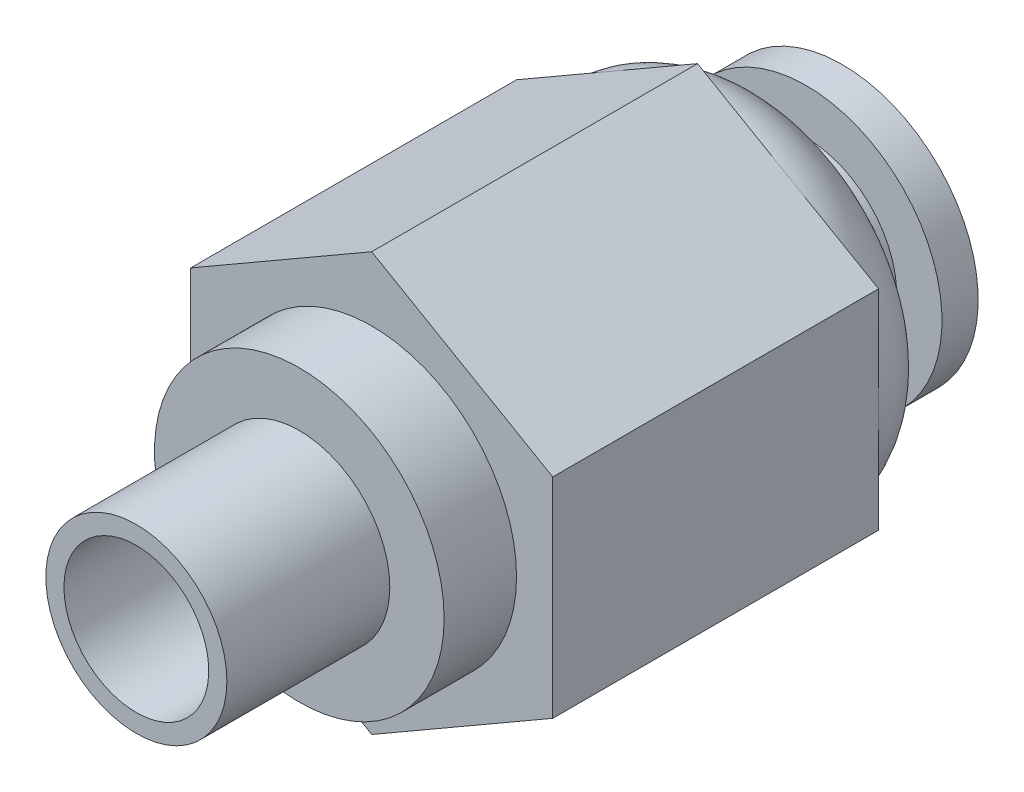
ISO-10303-21;
HEADER;
FILE_DESCRIPTION(('STEP AP214'),'2;1');
FILE_NAME('part.step','',(''),(''),'','','');
FILE_SCHEMA(('AUTOMOTIVE_DESIGN { 1 0 10303 214 1 1 1 1 }'));
ENDSEC;
DATA;
#1=APPLICATION_CONTEXT('core data for automotive mechanical design processes');
#2=APPLICATION_PROTOCOL_DEFINITION('international standard','automotive_design',2000,#1);
#3=PRODUCT_CONTEXT('',#1,'mechanical');
#4=PRODUCT('Part','Part','',(#3));
#5=PRODUCT_RELATED_PRODUCT_CATEGORY('part','',(#4));
#6=PRODUCT_DEFINITION_FORMATION('','',#4);
#7=PRODUCT_DEFINITION_CONTEXT('part definition',#1,'design');
#8=PRODUCT_DEFINITION('design','',#6,#7);
#9=PRODUCT_DEFINITION_SHAPE('','',#8);
#10=(LENGTH_UNIT() NAMED_UNIT(*) SI_UNIT(.MILLI.,.METRE.));
#11=(NAMED_UNIT(*) PLANE_ANGLE_UNIT() SI_UNIT($,.RADIAN.));
#12=(NAMED_UNIT(*) SI_UNIT($,.STERADIAN.) SOLID_ANGLE_UNIT());
#13=UNCERTAINTY_MEASURE_WITH_UNIT(LENGTH_MEASURE(1.E-05),#10,'distance_accuracy_value','');
#14=(GEOMETRIC_REPRESENTATION_CONTEXT(3) GLOBAL_UNCERTAINTY_ASSIGNED_CONTEXT((#13)) GLOBAL_UNIT_ASSIGNED_CONTEXT((#10,
#11,#12)) REPRESENTATION_CONTEXT('',''));
#15=CARTESIAN_POINT('',(0.,0.,0.));
#16=DIRECTION('',(0.,0.,1.));
#17=DIRECTION('',(1.,0.,0.));
#18=AXIS2_PLACEMENT_3D('',#15,#16,#17);
#19=CARTESIAN_POINT('',(0.,0.,0.));
#20=DIRECTION('',(0.,0.,1.));
#21=DIRECTION('',(1.,0.,0.));
#22=AXIS2_PLACEMENT_3D('',#19,#20,#21);
#23=PLANE('',#22);
#24=DIRECTION('',(0.,1.,0.));
#25=VECTOR('',#24,1.);
#26=CARTESIAN_POINT('',(5.,-2.88675134594813,0.));
#27=LINE('',#26,#25);
#28=CARTESIAN_POINT('',(5.,0.,0.));
#29=VERTEX_POINT('',#28);
#30=CARTESIAN_POINT('',(5.,2.88675134594813,0.));
#31=VERTEX_POINT('',#30);
#32=EDGE_CURVE('E154',#29,#31,#27,.T.);
#33=ORIENTED_EDGE('',*,*,#32,.F.);
#34=CARTESIAN_POINT('',(0.,0.,0.));
#35=DIRECTION('',(0.,0.,1.));
#36=DIRECTION('',(1.,0.,0.));
#37=AXIS2_PLACEMENT_3D('',#34,#35,#36);
#38=CIRCLE('',#37,5.);
#39=CARTESIAN_POINT('',(2.5,4.33012701892219,0.));
#40=VERTEX_POINT('',#39);
#41=EDGE_CURVE('E60',#29,#40,#38,.T.);
#42=ORIENTED_EDGE('',*,*,#41,.T.);
#43=DIRECTION('',(-0.866025403784439,0.5,0.));
#44=VECTOR('',#43,1.);
#45=CARTESIAN_POINT('',(5.,2.88675134594813,0.));
#46=LINE('',#45,#44);
#47=EDGE_CURVE('E155',#31,#40,#46,.T.);
#48=ORIENTED_EDGE('',*,*,#47,.F.);
#49=EDGE_LOOP('',(#33,#42,#48));
#50=FACE_BOUND('',#49,.T.);
#51=ADVANCED_FACE('F43',(#50),#23,.F.);
#52=CARTESIAN_POINT('',(0.,5.77350269189626,0.));
#53=VERTEX_POINT('',#52);
#54=EDGE_CURVE('E153',#40,#53,#46,.T.);
#55=ORIENTED_EDGE('',*,*,#54,.F.);
#56=CARTESIAN_POINT('',(0.,0.,0.));
#57=DIRECTION('',(0.,0.,1.));
#58=DIRECTION('',(1.,0.,0.));
#59=AXIS2_PLACEMENT_3D('',#56,#57,#58);
#60=CIRCLE('',#59,5.);
#61=CARTESIAN_POINT('',(-2.5,4.3301270189222,0.));
#62=VERTEX_POINT('',#61);
#63=EDGE_CURVE('E11',#40,#62,#60,.T.);
#64=ORIENTED_EDGE('',*,*,#63,.T.);
#65=DIRECTION('',(-0.866025403784439,-0.5,0.));
#66=VECTOR('',#65,1.);
#67=CARTESIAN_POINT('',(0.,5.77350269189626,0.));
#68=LINE('',#67,#66);
#69=EDGE_CURVE('E160',#53,#62,#68,.T.);
#70=ORIENTED_EDGE('',*,*,#69,.F.);
#71=EDGE_LOOP('',(#55,#64,#70));
#72=FACE_BOUND('',#71,.T.);
#73=ADVANCED_FACE('F273',(#72),#23,.F.);
#74=CARTESIAN_POINT('',(-5.,2.88675134594813,0.));
#75=VERTEX_POINT('',#74);
#76=EDGE_CURVE('E159',#62,#75,#68,.T.);
#77=ORIENTED_EDGE('',*,*,#76,.F.);
#78=CARTESIAN_POINT('',(-5.,0.,0.));
#79=VERTEX_POINT('',#78);
#80=EDGE_CURVE('E53',#62,#79,#60,.T.);
#81=ORIENTED_EDGE('',*,*,#80,.T.);
#82=DIRECTION('',(0.,-1.,0.));
#83=VECTOR('',#82,1.);
#84=CARTESIAN_POINT('',(-5.,2.88675134594813,0.));
#85=LINE('',#84,#83);
#86=EDGE_CURVE('E164',#75,#79,#85,.T.);
#87=ORIENTED_EDGE('',*,*,#86,.F.);
#88=EDGE_LOOP('',(#77,#81,#87));
#89=FACE_BOUND('',#88,.T.);
#90=ADVANCED_FACE('F280',(#89),#23,.F.);
#91=CARTESIAN_POINT('',(-5.,-2.88675134594813,0.));
#92=VERTEX_POINT('',#91);
#93=EDGE_CURVE('E132',#79,#92,#85,.T.);
#94=ORIENTED_EDGE('',*,*,#93,.F.);
#95=CARTESIAN_POINT('',(-2.5,-4.33012701892219,0.));
#96=VERTEX_POINT('',#95);
#97=EDGE_CURVE('E317',#79,#96,#60,.T.);
#98=ORIENTED_EDGE('',*,*,#97,.T.);
#99=DIRECTION('',(0.866025403784439,-0.5,0.));
#100=VECTOR('',#99,1.);
#101=CARTESIAN_POINT('',(-5.,-2.88675134594813,0.));
#102=LINE('',#101,#100);
#103=EDGE_CURVE('E168',#92,#96,#102,.T.);
#104=ORIENTED_EDGE('',*,*,#103,.F.);
#105=EDGE_LOOP('',(#94,#98,#104));
#106=FACE_BOUND('',#105,.T.);
#107=ADVANCED_FACE('F299',(#106),#23,.F.);
#108=CARTESIAN_POINT('',(0.,-5.77350269189626,0.));
#109=VERTEX_POINT('',#108);
#110=EDGE_CURVE('E167',#96,#109,#102,.T.);
#111=ORIENTED_EDGE('',*,*,#110,.F.);
#112=CARTESIAN_POINT('',(2.5,-4.33012701892219,0.));
#113=VERTEX_POINT('',#112);
#114=EDGE_CURVE('E313',#96,#113,#60,.T.);
#115=ORIENTED_EDGE('',*,*,#114,.T.);
#116=DIRECTION('',(0.866025403784438,0.5,0.));
#117=VECTOR('',#116,1.);
#118=CARTESIAN_POINT('',(0.,-5.77350269189626,0.));
#119=LINE('',#118,#117);
#120=EDGE_CURVE('E171',#109,#113,#119,.T.);
#121=ORIENTED_EDGE('',*,*,#120,.F.);
#122=EDGE_LOOP('',(#111,#115,#121));
#123=FACE_BOUND('',#122,.T.);
#124=ADVANCED_FACE('F288',(#123),#23,.F.);
#125=CARTESIAN_POINT('',(5.,-2.88675134594813,9.));
#126=DIRECTION('',(-1.,0.,0.));
#127=DIRECTION('',(0.,-1.,0.));
#128=AXIS2_PLACEMENT_3D('',#125,#126,#127);
#129=PLANE('',#128);
#130=CARTESIAN_POINT('',(5.,-2.88675134594813,0.));
#131=VERTEX_POINT('',#130);
#132=EDGE_CURVE('E149',#131,#29,#27,.T.);
#133=ORIENTED_EDGE('',*,*,#132,.T.);
#134=ORIENTED_EDGE('',*,*,#32,.T.);
#135=DIRECTION('',(0.,0.,-1.));
#136=VECTOR('',#135,1.);
#137=CARTESIAN_POINT('',(5.,2.88675134594813,9.));
#138=LINE('',#137,#136);
#139=CARTESIAN_POINT('',(5.,2.88675134594813,9.));
#140=VERTEX_POINT('',#139);
#141=EDGE_CURVE('E184',#140,#31,#138,.T.);
#142=ORIENTED_EDGE('',*,*,#141,.F.);
#143=DIRECTION('',(0.,1.,0.));
#144=VECTOR('',#143,1.);
#145=CARTESIAN_POINT('',(5.,-2.88675134594813,9.));
#146=LINE('',#145,#144);
#147=CARTESIAN_POINT('',(5.,-2.88675134594813,9.));
#148=VERTEX_POINT('',#147);
#149=EDGE_CURVE('E174',#148,#140,#146,.T.);
#150=ORIENTED_EDGE('',*,*,#149,.F.);
#151=DIRECTION('',(0.,0.,-1.));
#152=VECTOR('',#151,1.);
#153=CARTESIAN_POINT('',(5.,-2.88675134594813,9.));
#154=LINE('',#153,#152);
#155=EDGE_CURVE('E145',#148,#131,#154,.T.);
#156=ORIENTED_EDGE('',*,*,#155,.T.);
#157=EDGE_LOOP('',(#133,#134,#142,#150,#156));
#158=FACE_BOUND('',#157,.T.);
#159=ADVANCED_FACE('F45',(#158),#129,.F.);
#160=CARTESIAN_POINT('',(5.,2.88675134594813,9.));
#161=DIRECTION('',(-0.5,-0.866025403784439,0.));
#162=DIRECTION('',(0.866025403784439,-0.5,0.));
#163=AXIS2_PLACEMENT_3D('',#160,#161,#162);
#164=PLANE('',#163);
#165=ORIENTED_EDGE('',*,*,#47,.T.);
#166=ORIENTED_EDGE('',*,*,#54,.T.);
#167=DIRECTION('',(0.,0.,-1.));
#168=VECTOR('',#167,1.);
#169=CARTESIAN_POINT('',(0.,5.77350269189626,9.));
#170=LINE('',#169,#168);
#171=CARTESIAN_POINT('',(0.,5.77350269189626,9.));
#172=VERTEX_POINT('',#171);
#173=EDGE_CURVE('E181',#172,#53,#170,.T.);
#174=ORIENTED_EDGE('',*,*,#173,.F.);
#175=DIRECTION('',(-0.866025403784439,0.5,0.));
#176=VECTOR('',#175,1.);
#177=CARTESIAN_POINT('',(5.,2.88675134594813,9.));
#178=LINE('',#177,#176);
#179=EDGE_CURVE('E105',#140,#172,#178,.T.);
#180=ORIENTED_EDGE('',*,*,#179,.F.);
#181=ORIENTED_EDGE('',*,*,#141,.T.);
#182=EDGE_LOOP('',(#165,#166,#174,#180,#181));
#183=FACE_BOUND('',#182,.T.);
#184=ADVANCED_FACE('F305',(#183),#164,.F.);
#185=CARTESIAN_POINT('',(0.,5.77350269189626,9.));
#186=DIRECTION('',(0.5,-0.866025403784439,0.));
#187=DIRECTION('',(0.866025403784439,0.5,0.));
#188=AXIS2_PLACEMENT_3D('',#185,#186,#187);
#189=PLANE('',#188);
#190=ORIENTED_EDGE('',*,*,#69,.T.);
#191=ORIENTED_EDGE('',*,*,#76,.T.);
#192=DIRECTION('',(0.,0.,-1.));
#193=VECTOR('',#192,1.);
#194=CARTESIAN_POINT('',(-5.,2.88675134594813,9.));
#195=LINE('',#194,#193);
#196=CARTESIAN_POINT('',(-5.,2.88675134594813,9.));
#197=VERTEX_POINT('',#196);
#198=EDGE_CURVE('E137',#197,#75,#195,.T.);
#199=ORIENTED_EDGE('',*,*,#198,.F.);
#200=DIRECTION('',(-0.866025403784439,-0.5,0.));
#201=VECTOR('',#200,1.);
#202=CARTESIAN_POINT('',(0.,5.77350269189626,9.));
#203=LINE('',#202,#201);
#204=EDGE_CURVE('E121',#172,#197,#203,.T.);
#205=ORIENTED_EDGE('',*,*,#204,.F.);
#206=ORIENTED_EDGE('',*,*,#173,.T.);
#207=EDGE_LOOP('',(#190,#191,#199,#205,#206));
#208=FACE_BOUND('',#207,.T.);
#209=ADVANCED_FACE('F337',(#208),#189,.F.);
#210=CARTESIAN_POINT('',(-5.,2.88675134594813,9.));
#211=DIRECTION('',(1.,0.,0.));
#212=DIRECTION('',(0.,0.,-1.));
#213=AXIS2_PLACEMENT_3D('',#210,#211,#212);
#214=PLANE('',#213);
#215=ORIENTED_EDGE('',*,*,#86,.T.);
#216=ORIENTED_EDGE('',*,*,#93,.T.);
#217=DIRECTION('',(0.,0.,-1.));
#218=VECTOR('',#217,1.);
#219=CARTESIAN_POINT('',(-5.,-2.88675134594813,9.));
#220=LINE('',#219,#218);
#221=CARTESIAN_POINT('',(-5.,-2.88675134594813,9.));
#222=VERTEX_POINT('',#221);
#223=EDGE_CURVE('E128',#222,#92,#220,.T.);
#224=ORIENTED_EDGE('',*,*,#223,.F.);
#225=DIRECTION('',(0.,-1.,0.));
#226=VECTOR('',#225,1.);
#227=CARTESIAN_POINT('',(-5.,2.88675134594813,9.));
#228=LINE('',#227,#226);
#229=EDGE_CURVE('E114',#197,#222,#228,.T.);
#230=ORIENTED_EDGE('',*,*,#229,.F.);
#231=ORIENTED_EDGE('',*,*,#198,.T.);
#232=EDGE_LOOP('',(#215,#216,#224,#230,#231));
#233=FACE_BOUND('',#232,.T.);
#234=ADVANCED_FACE('F130',(#233),#214,.F.);
#235=CARTESIAN_POINT('',(-5.,-2.88675134594813,9.));
#236=DIRECTION('',(0.5,0.866025403784439,0.));
#237=DIRECTION('',(-0.866025403784439,0.5,0.));
#238=AXIS2_PLACEMENT_3D('',#235,#236,#237);
#239=PLANE('',#238);
#240=ORIENTED_EDGE('',*,*,#103,.T.);
#241=ORIENTED_EDGE('',*,*,#110,.T.);
#242=DIRECTION('',(0.,0.,-1.));
#243=VECTOR('',#242,1.);
#244=CARTESIAN_POINT('',(0.,-5.77350269189626,9.));
#245=LINE('',#244,#243);
#246=CARTESIAN_POINT('',(0.,-5.77350269189626,9.));
#247=VERTEX_POINT('',#246);
#248=EDGE_CURVE('E138',#247,#109,#245,.T.);
#249=ORIENTED_EDGE('',*,*,#248,.F.);
#250=DIRECTION('',(0.866025403784439,-0.5,0.));
#251=VECTOR('',#250,1.);
#252=CARTESIAN_POINT('',(-5.,-2.88675134594813,9.));
#253=LINE('',#252,#251);
#254=EDGE_CURVE('E118',#222,#247,#253,.T.);
#255=ORIENTED_EDGE('',*,*,#254,.F.);
#256=ORIENTED_EDGE('',*,*,#223,.T.);
#257=EDGE_LOOP('',(#240,#241,#249,#255,#256));
#258=FACE_BOUND('',#257,.T.);
#259=ADVANCED_FACE('F140',(#258),#239,.F.);
#260=CARTESIAN_POINT('',(0.,-5.77350269189626,9.));
#261=DIRECTION('',(-0.5,0.866025403784438,0.));
#262=DIRECTION('',(-0.866025403784438,-0.500000000000001,0.));
#263=AXIS2_PLACEMENT_3D('',#260,#261,#262);
#264=PLANE('',#263);
#265=ORIENTED_EDGE('',*,*,#120,.T.);
#266=EDGE_CURVE('E96',#113,#131,#119,.T.);
#267=ORIENTED_EDGE('',*,*,#266,.T.);
#268=ORIENTED_EDGE('',*,*,#155,.F.);
#269=DIRECTION('',(0.866025403784438,0.5,0.));
#270=VECTOR('',#269,1.);
#271=CARTESIAN_POINT('',(0.,-5.77350269189626,9.));
#272=LINE('',#271,#270);
#273=EDGE_CURVE('E69',#247,#148,#272,.T.);
#274=ORIENTED_EDGE('',*,*,#273,.F.);
#275=ORIENTED_EDGE('',*,*,#248,.T.);
#276=EDGE_LOOP('',(#265,#267,#268,#274,#275));
#277=FACE_BOUND('',#276,.T.);
#278=ADVANCED_FACE('F296',(#277),#264,.F.);
#279=CARTESIAN_POINT('',(0.,0.,9.));
#280=DIRECTION('',(0.,0.,1.));
#281=DIRECTION('',(1.,0.,0.));
#282=AXIS2_PLACEMENT_3D('',#279,#280,#281);
#283=PLANE('',#282);
#284=CARTESIAN_POINT('',(0.,0.,9.));
#285=DIRECTION('',(0.,0.,1.));
#286=DIRECTION('',(1.,0.,0.));
#287=AXIS2_PLACEMENT_3D('',#284,#285,#286);
#288=CIRCLE('',#287,4.);
#289=CARTESIAN_POINT('',(4.,0.,9.));
#290=VERTEX_POINT('',#289);
#291=EDGE_CURVE('E186',#290,#290,#288,.T.);
#292=ORIENTED_EDGE('',*,*,#291,.F.);
#293=EDGE_LOOP('',(#292));
#294=FACE_BOUND('',#293,.T.);
#295=ORIENTED_EDGE('',*,*,#149,.T.);
#296=ORIENTED_EDGE('',*,*,#179,.T.);
#297=ORIENTED_EDGE('',*,*,#204,.T.);
#298=ORIENTED_EDGE('',*,*,#229,.T.);
#299=ORIENTED_EDGE('',*,*,#254,.T.);
#300=ORIENTED_EDGE('',*,*,#273,.T.);
#301=EDGE_LOOP('',(#295,#296,#297,#298,#299,#300));
#302=FACE_BOUND('',#301,.T.);
#303=ADVANCED_FACE('F116',(#294,#302),#283,.T.);
#304=ORIENTED_EDGE('',*,*,#266,.F.);
#305=EDGE_CURVE('E47',#113,#29,#60,.T.);
#306=ORIENTED_EDGE('',*,*,#305,.T.);
#307=ORIENTED_EDGE('',*,*,#132,.F.);
#308=EDGE_LOOP('',(#304,#306,#307));
#309=FACE_BOUND('',#308,.T.);
#310=ADVANCED_FACE('F276',(#309),#23,.F.);
#311=CARTESIAN_POINT('',(0.,0.,11.));
#312=DIRECTION('',(0.,0.,-1.));
#313=DIRECTION('',(-1.,0.,0.));
#314=AXIS2_PLACEMENT_3D('',#311,#312,#313);
#315=CYLINDRICAL_SURFACE('',#314,4.);
#316=CARTESIAN_POINT('',(0.,0.,11.));
#317=DIRECTION('',(0.,0.,1.));
#318=DIRECTION('',(1.,0.,0.));
#319=AXIS2_PLACEMENT_3D('',#316,#317,#318);
#320=CIRCLE('',#319,4.);
#321=CARTESIAN_POINT('',(4.,0.,11.));
#322=VERTEX_POINT('',#321);
#323=EDGE_CURVE('E199',#322,#322,#320,.T.);
#324=ORIENTED_EDGE('',*,*,#323,.F.);
#325=EDGE_LOOP('',(#324));
#326=FACE_BOUND('',#325,.T.);
#327=ORIENTED_EDGE('',*,*,#291,.T.);
#328=EDGE_LOOP('',(#327));
#329=FACE_BOUND('',#328,.T.);
#330=ADVANCED_FACE('F286',(#326,#329),#315,.T.);
#331=CARTESIAN_POINT('',(0.,0.,11.));
#332=DIRECTION('',(0.,0.,1.));
#333=DIRECTION('',(1.,0.,0.));
#334=AXIS2_PLACEMENT_3D('',#331,#332,#333);
#335=PLANE('',#334);
#336=CARTESIAN_POINT('',(0.,0.,11.));
#337=DIRECTION('',(0.,0.,1.));
#338=DIRECTION('',(1.,0.,0.));
#339=AXIS2_PLACEMENT_3D('',#336,#337,#338);
#340=CIRCLE('',#339,2.5);
#341=CARTESIAN_POINT('',(2.5,0.,11.));
#342=VERTEX_POINT('',#341);
#343=EDGE_CURVE('E190',#342,#342,#340,.T.);
#344=ORIENTED_EDGE('',*,*,#343,.F.);
#345=EDGE_LOOP('',(#344));
#346=FACE_BOUND('',#345,.T.);
#347=ORIENTED_EDGE('',*,*,#323,.T.);
#348=EDGE_LOOP('',(#347));
#349=FACE_BOUND('',#348,.T.);
#350=ADVANCED_FACE('F293',(#346,#349),#335,.T.);
#351=CARTESIAN_POINT('',(0.,0.,15.5));
#352=DIRECTION('',(0.,0.,-1.));
#353=DIRECTION('',(-1.,0.,0.));
#354=AXIS2_PLACEMENT_3D('',#351,#352,#353);
#355=CYLINDRICAL_SURFACE('',#354,2.5);
#356=CARTESIAN_POINT('',(0.,0.,15.5));
#357=DIRECTION('',(0.,0.,1.));
#358=DIRECTION('',(1.,0.,0.));
#359=AXIS2_PLACEMENT_3D('',#356,#357,#358);
#360=CIRCLE('',#359,2.5);
#361=CARTESIAN_POINT('',(2.5,0.,15.5));
#362=VERTEX_POINT('',#361);
#363=EDGE_CURVE('E213',#362,#362,#360,.T.);
#364=ORIENTED_EDGE('',*,*,#363,.F.);
#365=EDGE_LOOP('',(#364));
#366=FACE_BOUND('',#365,.T.);
#367=ORIENTED_EDGE('',*,*,#343,.T.);
#368=EDGE_LOOP('',(#367));
#369=FACE_BOUND('',#368,.T.);
#370=ADVANCED_FACE('F455',(#366,#369),#355,.T.);
#371=CARTESIAN_POINT('',(0.,0.,15.5));
#372=DIRECTION('',(0.,0.,1.));
#373=DIRECTION('',(1.,0.,0.));
#374=AXIS2_PLACEMENT_3D('',#371,#372,#373);
#375=PLANE('',#374);
#376=CARTESIAN_POINT('',(0.,0.,15.5));
#377=DIRECTION('',(0.,0.,-1.));
#378=DIRECTION('',(-1.,0.,0.));
#379=AXIS2_PLACEMENT_3D('',#376,#377,#378);
#380=CIRCLE('',#379,2.);
#381=CARTESIAN_POINT('',(-2.,0.,15.5));
#382=VERTEX_POINT('',#381);
#383=EDGE_CURVE('E238',#382,#382,#380,.T.);
#384=ORIENTED_EDGE('',*,*,#383,.T.);
#385=EDGE_LOOP('',(#384));
#386=FACE_BOUND('',#385,.T.);
#387=ORIENTED_EDGE('',*,*,#363,.T.);
#388=EDGE_LOOP('',(#387));
#389=FACE_BOUND('',#388,.T.);
#390=ADVANCED_FACE('F425',(#386,#389),#375,.T.);
#391=CARTESIAN_POINT('',(0.,0.,-2.));
#392=DIRECTION('',(0.,0.,-1.));
#393=DIRECTION('',(-1.,0.,0.));
#394=AXIS2_PLACEMENT_3D('',#391,#392,#393);
#395=PLANE('',#394);
#396=CARTESIAN_POINT('',(0.,0.,-2.));
#397=DIRECTION('',(0.,0.,-1.));
#398=DIRECTION('',(-1.,0.,0.));
#399=AXIS2_PLACEMENT_3D('',#396,#397,#398);
#400=CIRCLE('',#399,2.5);
#401=CARTESIAN_POINT('',(-2.5,0.,-2.));
#402=VERTEX_POINT('',#401);
#403=EDGE_CURVE('E226',#402,#402,#400,.T.);
#404=ORIENTED_EDGE('',*,*,#403,.F.);
#405=EDGE_LOOP('',(#404));
#406=FACE_BOUND('',#405,.T.);
#407=CARTESIAN_POINT('',(0.,0.,-2.));
#408=DIRECTION('',(0.,0.,1.));
#409=DIRECTION('',(1.,0.,0.));
#410=AXIS2_PLACEMENT_3D('',#407,#408,#409);
#411=CIRCLE('',#410,3.);
#412=CARTESIAN_POINT('',(3.,0.,-2.));
#413=VERTEX_POINT('',#412);
#414=EDGE_CURVE('E216',#413,#413,#411,.T.);
#415=ORIENTED_EDGE('',*,*,#414,.F.);
#416=EDGE_LOOP('',(#415));
#417=FACE_BOUND('',#416,.T.);
#418=ADVANCED_FACE('F413',(#406,#417),#395,.T.);
#419=CARTESIAN_POINT('',(0.,0.,0.));
#420=DIRECTION('',(0.,0.,1.));
#421=DIRECTION('',(1.,0.,0.));
#422=AXIS2_PLACEMENT_3D('',#419,#420,#421);
#423=TOROIDAL_SURFACE('',#422,3.,2.);
#424=ORIENTED_EDGE('',*,*,#414,.T.);
#425=EDGE_LOOP('',(#424));
#426=FACE_BOUND('',#425,.T.);
#427=ORIENTED_EDGE('',*,*,#41,.F.);
#428=ORIENTED_EDGE('',*,*,#305,.F.);
#429=ORIENTED_EDGE('',*,*,#114,.F.);
#430=ORIENTED_EDGE('',*,*,#97,.F.);
#431=ORIENTED_EDGE('',*,*,#80,.F.);
#432=ORIENTED_EDGE('',*,*,#63,.F.);
#433=EDGE_LOOP('',(#427,#428,#429,#430,#431,#432));
#434=FACE_BOUND('',#433,.T.);
#435=ADVANCED_FACE('F347',(#426,#434),#423,.T.);
#436=CARTESIAN_POINT('',(0.,0.,-3.));
#437=DIRECTION('',(0.,0.,1.));
#438=DIRECTION('',(1.,0.,0.));
#439=AXIS2_PLACEMENT_3D('',#436,#437,#438);
#440=CYLINDRICAL_SURFACE('',#439,2.5);
#441=CARTESIAN_POINT('',(0.,0.,-3.));
#442=DIRECTION('',(0.,0.,-1.));
#443=DIRECTION('',(-1.,0.,0.));
#444=AXIS2_PLACEMENT_3D('',#441,#442,#443);
#445=CIRCLE('',#444,2.5);
#446=CARTESIAN_POINT('',(-2.5,0.,-3.));
#447=VERTEX_POINT('',#446);
#448=EDGE_CURVE('E222',#447,#447,#445,.T.);
#449=ORIENTED_EDGE('',*,*,#448,.F.);
#450=EDGE_LOOP('',(#449));
#451=FACE_BOUND('',#450,.T.);
#452=ORIENTED_EDGE('',*,*,#403,.T.);
#453=EDGE_LOOP('',(#452));
#454=FACE_BOUND('',#453,.T.);
#455=ADVANCED_FACE('F260',(#451,#454),#440,.T.);
#456=CARTESIAN_POINT('',(0.,0.,-4.));
#457=DIRECTION('',(0.,0.,1.));
#458=DIRECTION('',(1.,0.,0.));
#459=AXIS2_PLACEMENT_3D('',#456,#457,#458);
#460=CYLINDRICAL_SURFACE('',#459,3.75);
#461=CARTESIAN_POINT('',(0.,0.,-4.));
#462=DIRECTION('',(0.,0.,-1.));
#463=DIRECTION('',(-1.,0.,0.));
#464=AXIS2_PLACEMENT_3D('',#461,#462,#463);
#465=CIRCLE('',#464,3.75);
#466=CARTESIAN_POINT('',(-3.75,0.,-4.));
#467=VERTEX_POINT('',#466);
#468=EDGE_CURVE('E230',#467,#467,#465,.T.);
#469=ORIENTED_EDGE('',*,*,#468,.F.);
#470=EDGE_LOOP('',(#469));
#471=FACE_BOUND('',#470,.T.);
#472=CARTESIAN_POINT('',(0.,0.,-3.));
#473=DIRECTION('',(0.,0.,-1.));
#474=DIRECTION('',(-1.,0.,0.));
#475=AXIS2_PLACEMENT_3D('',#472,#473,#474);
#476=CIRCLE('',#475,3.75);
#477=CARTESIAN_POINT('',(-3.75,0.,-3.));
#478=VERTEX_POINT('',#477);
#479=EDGE_CURVE('E234',#478,#478,#476,.T.);
#480=ORIENTED_EDGE('',*,*,#479,.T.);
#481=EDGE_LOOP('',(#480));
#482=FACE_BOUND('',#481,.T.);
#483=ADVANCED_FACE('F254',(#471,#482),#460,.T.);
#484=CARTESIAN_POINT('',(0.,0.,-4.));
#485=DIRECTION('',(0.,0.,-1.));
#486=DIRECTION('',(-1.,0.,0.));
#487=AXIS2_PLACEMENT_3D('',#484,#485,#486);
#488=PLANE('',#487);
#489=CARTESIAN_POINT('',(0.,0.,-4.));
#490=DIRECTION('',(0.,0.,-1.));
#491=DIRECTION('',(-1.,0.,0.));
#492=AXIS2_PLACEMENT_3D('',#489,#490,#491);
#493=CIRCLE('',#492,2.);
#494=CARTESIAN_POINT('',(-2.,0.,-4.));
#495=VERTEX_POINT('',#494);
#496=EDGE_CURVE('E242',#495,#495,#493,.T.);
#497=ORIENTED_EDGE('',*,*,#496,.F.);
#498=EDGE_LOOP('',(#497));
#499=FACE_BOUND('',#498,.T.);
#500=ORIENTED_EDGE('',*,*,#468,.T.);
#501=EDGE_LOOP('',(#500));
#502=FACE_BOUND('',#501,.T.);
#503=ADVANCED_FACE('F250',(#499,#502),#488,.T.);
#504=CARTESIAN_POINT('',(0.,0.,-3.));
#505=DIRECTION('',(0.,0.,-1.));
#506=DIRECTION('',(-1.,0.,0.));
#507=AXIS2_PLACEMENT_3D('',#504,#505,#506);
#508=PLANE('',#507);
#509=ORIENTED_EDGE('',*,*,#448,.T.);
#510=EDGE_LOOP('',(#509));
#511=FACE_BOUND('',#510,.T.);
#512=ORIENTED_EDGE('',*,*,#479,.F.);
#513=EDGE_LOOP('',(#512));
#514=FACE_BOUND('',#513,.T.);
#515=ADVANCED_FACE('F253',(#511,#514),#508,.F.);
#516=CARTESIAN_POINT('',(0.,0.,15.5));
#517=DIRECTION('',(0.,0.,-1.));
#518=DIRECTION('',(-1.,0.,0.));
#519=AXIS2_PLACEMENT_3D('',#516,#517,#518);
#520=CYLINDRICAL_SURFACE('',#519,2.);
#521=ORIENTED_EDGE('',*,*,#383,.F.);
#522=EDGE_LOOP('',(#521));
#523=FACE_BOUND('',#522,.T.);
#524=ORIENTED_EDGE('',*,*,#496,.T.);
#525=EDGE_LOOP('',(#524));
#526=FACE_BOUND('',#525,.T.);
#527=ADVANCED_FACE('F248',(#523,#526),#520,.F.);
#528=CLOSED_SHELL('',(#51,#73,#90,#107,#124,#159,#184,#209,#234,#259,#278,#303,#310,#330,#350,
#370,#390,#418,#435,#455,#483,#503,#515,#527));
#529=MANIFOLD_SOLID_BREP('B2',#528);
#530=ADVANCED_BREP_SHAPE_REPRESENTATION('',(#18,#529),#14);
#531=SHAPE_DEFINITION_REPRESENTATION(#9,#530);
ENDSEC;
END-ISO-10303-21;
